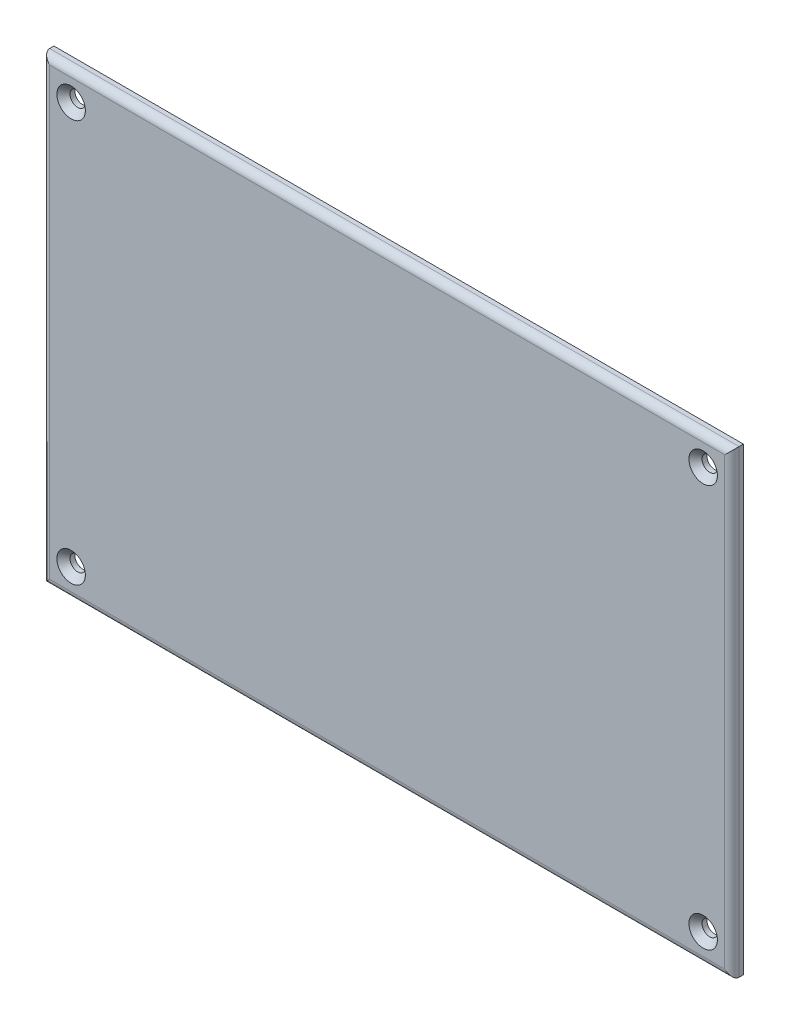
ISO-10303-21;
HEADER;
FILE_DESCRIPTION(('STEP AP214'),'2;1');
FILE_NAME('part.step','',(''),(''),'','','');
FILE_SCHEMA(('AUTOMOTIVE_DESIGN { 1 0 10303 214 1 1 1 1 }'));
ENDSEC;
DATA;
#1=APPLICATION_CONTEXT('core data for automotive mechanical design processes');
#2=APPLICATION_PROTOCOL_DEFINITION('international standard','automotive_design',2000,#1);
#3=PRODUCT_CONTEXT('',#1,'mechanical');
#4=PRODUCT('Part','Part','',(#3));
#5=PRODUCT_RELATED_PRODUCT_CATEGORY('part','',(#4));
#6=PRODUCT_DEFINITION_FORMATION('','',#4);
#7=PRODUCT_DEFINITION_CONTEXT('part definition',#1,'design');
#8=PRODUCT_DEFINITION('design','',#6,#7);
#9=PRODUCT_DEFINITION_SHAPE('','',#8);
#10=(LENGTH_UNIT() NAMED_UNIT(*) SI_UNIT(.MILLI.,.METRE.));
#11=(NAMED_UNIT(*) PLANE_ANGLE_UNIT() SI_UNIT($,.RADIAN.));
#12=(NAMED_UNIT(*) SI_UNIT($,.STERADIAN.) SOLID_ANGLE_UNIT());
#13=UNCERTAINTY_MEASURE_WITH_UNIT(LENGTH_MEASURE(1.E-05),#10,'distance_accuracy_value','');
#14=(GEOMETRIC_REPRESENTATION_CONTEXT(3) GLOBAL_UNCERTAINTY_ASSIGNED_CONTEXT((#13)) GLOBAL_UNIT_ASSIGNED_CONTEXT((#10,
#11,#12)) REPRESENTATION_CONTEXT('',''));
#15=CARTESIAN_POINT('',(0.,0.,0.));
#16=DIRECTION('',(0.,0.,1.));
#17=DIRECTION('',(1.,0.,0.));
#18=AXIS2_PLACEMENT_3D('',#15,#16,#17);
#19=CARTESIAN_POINT('',(0.,0.,2.54));
#20=DIRECTION('',(1.,0.,0.));
#21=DIRECTION('',(0.,0.,-1.));
#22=AXIS2_PLACEMENT_3D('',#19,#20,#21);
#23=PLANE('',#22);
#24=DIRECTION('',(0.,0.,-1.));
#25=VECTOR('',#24,1.);
#26=CARTESIAN_POINT('',(0.,0.,2.54));
#27=LINE('',#26,#25);
#28=CARTESIAN_POINT('',(0.,0.,0.9525));
#29=VERTEX_POINT('',#28);
#30=CARTESIAN_POINT('',(0.,0.,0.));
#31=VERTEX_POINT('',#30);
#32=EDGE_CURVE('E91',#29,#31,#27,.T.);
#33=ORIENTED_EDGE('',*,*,#32,.F.);
#34=DIRECTION('',(0.,-1.,0.));
#35=VECTOR('',#34,1.);
#36=CARTESIAN_POINT('',(0.,0.,0.9525));
#37=LINE('',#36,#35);
#38=CARTESIAN_POINT('',(0.,101.6,0.9525));
#39=VERTEX_POINT('',#38);
#40=EDGE_CURVE('E11',#29,#39,#37,.F.);
#41=ORIENTED_EDGE('',*,*,#40,.T.);
#42=DIRECTION('',(0.,0.,-1.));
#43=VECTOR('',#42,1.);
#44=CARTESIAN_POINT('',(0.,101.6,2.54));
#45=LINE('',#44,#43);
#46=CARTESIAN_POINT('',(0.,101.6,0.));
#47=VERTEX_POINT('',#46);
#48=EDGE_CURVE('E113',#39,#47,#45,.T.);
#49=ORIENTED_EDGE('',*,*,#48,.T.);
#50=DIRECTION('',(0.,-1.,0.));
#51=VECTOR('',#50,1.);
#52=CARTESIAN_POINT('',(0.,0.,0.));
#53=LINE('',#52,#51);
#54=EDGE_CURVE('E107',#47,#31,#53,.T.);
#55=ORIENTED_EDGE('',*,*,#54,.T.);
#56=EDGE_LOOP('',(#33,#41,#49,#55));
#57=FACE_BOUND('',#56,.T.);
#58=ADVANCED_FACE('F38',(#57),#23,.F.);
#59=CARTESIAN_POINT('',(0.,0.,2.54));
#60=DIRECTION('',(0.,1.,0.));
#61=DIRECTION('',(0.,0.,1.));
#62=AXIS2_PLACEMENT_3D('',#59,#60,#61);
#63=PLANE('',#62);
#64=DIRECTION('',(0.,0.,-1.));
#65=VECTOR('',#64,1.);
#66=CARTESIAN_POINT('',(152.4,0.,2.54));
#67=LINE('',#66,#65);
#68=CARTESIAN_POINT('',(152.4,0.,0.9525));
#69=VERTEX_POINT('',#68);
#70=CARTESIAN_POINT('',(152.4,0.,0.));
#71=VERTEX_POINT('',#70);
#72=EDGE_CURVE('E101',#69,#71,#67,.T.);
#73=ORIENTED_EDGE('',*,*,#72,.F.);
#74=DIRECTION('',(1.,0.,0.));
#75=VECTOR('',#74,1.);
#76=CARTESIAN_POINT('',(0.,0.,0.9525));
#77=LINE('',#76,#75);
#78=EDGE_CURVE('E48',#69,#29,#77,.F.);
#79=ORIENTED_EDGE('',*,*,#78,.T.);
#80=ORIENTED_EDGE('',*,*,#32,.T.);
#81=DIRECTION('',(1.,0.,0.));
#82=VECTOR('',#81,1.);
#83=CARTESIAN_POINT('',(0.,0.,0.));
#84=LINE('',#83,#82);
#85=EDGE_CURVE('E94',#31,#71,#84,.T.);
#86=ORIENTED_EDGE('',*,*,#85,.T.);
#87=EDGE_LOOP('',(#73,#79,#80,#86));
#88=FACE_BOUND('',#87,.T.);
#89=ADVANCED_FACE('F93',(#88),#63,.F.);
#90=CARTESIAN_POINT('',(152.4,0.,2.54));
#91=DIRECTION('',(-1.,0.,0.));
#92=DIRECTION('',(0.,0.,1.));
#93=AXIS2_PLACEMENT_3D('',#90,#91,#92);
#94=PLANE('',#93);
#95=DIRECTION('',(0.,0.,-1.));
#96=VECTOR('',#95,1.);
#97=CARTESIAN_POINT('',(152.4,101.6,2.54));
#98=LINE('',#97,#96);
#99=CARTESIAN_POINT('',(152.4,101.6,0.9525));
#100=VERTEX_POINT('',#99);
#101=CARTESIAN_POINT('',(152.4,101.6,0.));
#102=VERTEX_POINT('',#101);
#103=EDGE_CURVE('E133',#100,#102,#98,.T.);
#104=ORIENTED_EDGE('',*,*,#103,.F.);
#105=DIRECTION('',(0.,1.,0.));
#106=VECTOR('',#105,1.);
#107=CARTESIAN_POINT('',(152.4,0.,0.9525));
#108=LINE('',#107,#106);
#109=EDGE_CURVE('E63',#100,#69,#108,.F.);
#110=ORIENTED_EDGE('',*,*,#109,.T.);
#111=ORIENTED_EDGE('',*,*,#72,.T.);
#112=DIRECTION('',(0.,1.,0.));
#113=VECTOR('',#112,1.);
#114=CARTESIAN_POINT('',(152.4,0.,0.));
#115=LINE('',#114,#113);
#116=EDGE_CURVE('E109',#71,#102,#115,.T.);
#117=ORIENTED_EDGE('',*,*,#116,.T.);
#118=EDGE_LOOP('',(#104,#110,#111,#117));
#119=FACE_BOUND('',#118,.T.);
#120=ADVANCED_FACE('F228',(#119),#94,.F.);
#121=CARTESIAN_POINT('',(0.,101.6,2.54));
#122=DIRECTION('',(0.,-1.,0.));
#123=DIRECTION('',(0.,0.,-1.));
#124=AXIS2_PLACEMENT_3D('',#121,#122,#123);
#125=PLANE('',#124);
#126=ORIENTED_EDGE('',*,*,#48,.F.);
#127=DIRECTION('',(-1.,0.,0.));
#128=VECTOR('',#127,1.);
#129=CARTESIAN_POINT('',(0.,101.6,0.9525));
#130=LINE('',#129,#128);
#131=EDGE_CURVE('E150',#39,#100,#130,.F.);
#132=ORIENTED_EDGE('',*,*,#131,.T.);
#133=ORIENTED_EDGE('',*,*,#103,.T.);
#134=DIRECTION('',(-1.,0.,0.));
#135=VECTOR('',#134,1.);
#136=CARTESIAN_POINT('',(0.,101.6,0.));
#137=LINE('',#136,#135);
#138=EDGE_CURVE('E128',#102,#47,#137,.T.);
#139=ORIENTED_EDGE('',*,*,#138,.T.);
#140=EDGE_LOOP('',(#126,#132,#133,#139));
#141=FACE_BOUND('',#140,.T.);
#142=ADVANCED_FACE('F254',(#141),#125,.F.);
#143=CARTESIAN_POINT('',(0.,0.,2.54));
#144=DIRECTION('',(0.,0.,-1.));
#145=DIRECTION('',(-1.,0.,0.));
#146=AXIS2_PLACEMENT_3D('',#143,#144,#145);
#147=PLANE('',#146);
#148=CARTESIAN_POINT('',(6.34999999999999,95.25,2.54));
#149=DIRECTION('',(0.,0.,1.));
#150=DIRECTION('',(1.,0.,0.));
#151=AXIS2_PLACEMENT_3D('',#148,#149,#150);
#152=CIRCLE('',#151,3.15);
#153=CARTESIAN_POINT('',(9.49999999999999,95.25,2.54));
#154=VERTEX_POINT('',#153);
#155=EDGE_CURVE('E384',#154,#154,#152,.T.);
#156=ORIENTED_EDGE('',*,*,#155,.F.);
#157=EDGE_LOOP('',(#156));
#158=FACE_BOUND('',#157,.T.);
#159=CARTESIAN_POINT('',(6.35,6.35,2.54));
#160=DIRECTION('',(0.,0.,1.));
#161=DIRECTION('',(1.,0.,0.));
#162=AXIS2_PLACEMENT_3D('',#159,#160,#161);
#163=CIRCLE('',#162,3.15);
#164=CARTESIAN_POINT('',(9.5,6.35,2.54));
#165=VERTEX_POINT('',#164);
#166=EDGE_CURVE('E188',#165,#165,#163,.T.);
#167=ORIENTED_EDGE('',*,*,#166,.F.);
#168=EDGE_LOOP('',(#167));
#169=FACE_BOUND('',#168,.T.);
#170=CARTESIAN_POINT('',(146.05,6.35,2.54));
#171=DIRECTION('',(0.,0.,1.));
#172=DIRECTION('',(1.,0.,0.));
#173=AXIS2_PLACEMENT_3D('',#170,#171,#172);
#174=CIRCLE('',#173,3.15000000000001);
#175=CARTESIAN_POINT('',(149.2,6.35,2.54));
#176=VERTEX_POINT('',#175);
#177=EDGE_CURVE('E179',#176,#176,#174,.T.);
#178=ORIENTED_EDGE('',*,*,#177,.F.);
#179=EDGE_LOOP('',(#178));
#180=FACE_BOUND('',#179,.T.);
#181=CARTESIAN_POINT('',(146.05,95.25,2.54));
#182=DIRECTION('',(0.,0.,1.));
#183=DIRECTION('',(1.,0.,0.));
#184=AXIS2_PLACEMENT_3D('',#181,#182,#183);
#185=CIRCLE('',#184,3.15000000000001);
#186=CARTESIAN_POINT('',(149.2,95.25,2.54));
#187=VERTEX_POINT('',#186);
#188=EDGE_CURVE('E174',#187,#187,#185,.T.);
#189=ORIENTED_EDGE('',*,*,#188,.F.);
#190=EDGE_LOOP('',(#189));
#191=FACE_BOUND('',#190,.T.);
#192=DIRECTION('',(0.,1.,0.));
#193=VECTOR('',#192,1.);
#194=CARTESIAN_POINT('',(150.8125,0.,2.54));
#195=LINE('',#194,#193);
#196=CARTESIAN_POINT('',(150.8125,1.5875,2.54));
#197=VERTEX_POINT('',#196);
#198=CARTESIAN_POINT('',(150.8125,100.0125,2.54));
#199=VERTEX_POINT('',#198);
#200=EDGE_CURVE('E143',#197,#199,#195,.T.);
#201=ORIENTED_EDGE('',*,*,#200,.T.);
#202=DIRECTION('',(-1.,0.,0.));
#203=VECTOR('',#202,1.);
#204=CARTESIAN_POINT('',(0.,100.0125,2.54));
#205=LINE('',#204,#203);
#206=CARTESIAN_POINT('',(1.5875,100.0125,2.54));
#207=VERTEX_POINT('',#206);
#208=EDGE_CURVE('E146',#199,#207,#205,.T.);
#209=ORIENTED_EDGE('',*,*,#208,.T.);
#210=DIRECTION('',(0.,-1.,0.));
#211=VECTOR('',#210,1.);
#212=CARTESIAN_POINT('',(1.5875,0.,2.54));
#213=LINE('',#212,#211);
#214=CARTESIAN_POINT('',(1.5875,1.5875,2.54));
#215=VERTEX_POINT('',#214);
#216=EDGE_CURVE('E100',#207,#215,#213,.T.);
#217=ORIENTED_EDGE('',*,*,#216,.T.);
#218=DIRECTION('',(1.,0.,0.));
#219=VECTOR('',#218,1.);
#220=CARTESIAN_POINT('',(0.,1.5875,2.54));
#221=LINE('',#220,#219);
#222=EDGE_CURVE('E140',#215,#197,#221,.T.);
#223=ORIENTED_EDGE('',*,*,#222,.T.);
#224=EDGE_LOOP('',(#201,#209,#217,#223));
#225=FACE_BOUND('',#224,.T.);
#226=ADVANCED_FACE('F257',(#158,#169,#180,#191,#225),#147,.F.);
#227=CARTESIAN_POINT('',(0.,0.,0.));
#228=DIRECTION('',(0.,0.,-1.));
#229=DIRECTION('',(-1.,0.,0.));
#230=AXIS2_PLACEMENT_3D('',#227,#228,#229);
#231=PLANE('',#230);
#232=CARTESIAN_POINT('',(6.34999999999999,95.25,0.));
#233=DIRECTION('',(0.,0.,-1.));
#234=DIRECTION('',(-1.,0.,0.));
#235=AXIS2_PLACEMENT_3D('',#232,#233,#234);
#236=CIRCLE('',#235,1.69999999999999);
#237=CARTESIAN_POINT('',(4.64999999999999,95.25,0.));
#238=VERTEX_POINT('',#237);
#239=EDGE_CURVE('E42',#238,#238,#236,.T.);
#240=ORIENTED_EDGE('',*,*,#239,.F.);
#241=EDGE_LOOP('',(#240));
#242=FACE_BOUND('',#241,.T.);
#243=CARTESIAN_POINT('',(6.35,6.35,0.));
#244=DIRECTION('',(0.,0.,-1.));
#245=DIRECTION('',(-1.,0.,0.));
#246=AXIS2_PLACEMENT_3D('',#243,#244,#245);
#247=CIRCLE('',#246,1.69999999999999);
#248=CARTESIAN_POINT('',(4.65000000000001,6.35,0.));
#249=VERTEX_POINT('',#248);
#250=EDGE_CURVE('E176',#249,#249,#247,.T.);
#251=ORIENTED_EDGE('',*,*,#250,.F.);
#252=EDGE_LOOP('',(#251));
#253=FACE_BOUND('',#252,.T.);
#254=CARTESIAN_POINT('',(146.05,6.35,0.));
#255=DIRECTION('',(0.,0.,-1.));
#256=DIRECTION('',(-1.,0.,0.));
#257=AXIS2_PLACEMENT_3D('',#254,#255,#256);
#258=CIRCLE('',#257,1.69999999999999);
#259=CARTESIAN_POINT('',(144.35,6.35,0.));
#260=VERTEX_POINT('',#259);
#261=EDGE_CURVE('E171',#260,#260,#258,.T.);
#262=ORIENTED_EDGE('',*,*,#261,.F.);
#263=EDGE_LOOP('',(#262));
#264=FACE_BOUND('',#263,.T.);
#265=CARTESIAN_POINT('',(146.05,95.25,0.));
#266=DIRECTION('',(0.,0.,-1.));
#267=DIRECTION('',(-1.,0.,0.));
#268=AXIS2_PLACEMENT_3D('',#265,#266,#267);
#269=CIRCLE('',#268,1.69999999999999);
#270=CARTESIAN_POINT('',(144.35,95.25,0.));
#271=VERTEX_POINT('',#270);
#272=EDGE_CURVE('E162',#271,#271,#269,.T.);
#273=ORIENTED_EDGE('',*,*,#272,.F.);
#274=EDGE_LOOP('',(#273));
#275=FACE_BOUND('',#274,.T.);
#276=ORIENTED_EDGE('',*,*,#54,.F.);
#277=ORIENTED_EDGE('',*,*,#138,.F.);
#278=ORIENTED_EDGE('',*,*,#116,.F.);
#279=ORIENTED_EDGE('',*,*,#85,.F.);
#280=EDGE_LOOP('',(#276,#277,#278,#279));
#281=FACE_BOUND('',#280,.T.);
#282=ADVANCED_FACE('F105',(#242,#253,#264,#275,#281),#231,.T.);
#283=CARTESIAN_POINT('',(0.,1.5875,0.9525));
#284=DIRECTION('',(1.,0.,0.));
#285=DIRECTION('',(0.,0.,-1.));
#286=AXIS2_PLACEMENT_3D('',#283,#284,#285);
#287=CYLINDRICAL_SURFACE('',#286,1.5875);
#288=CARTESIAN_POINT('',(1.5875,1.5875,0.9525));
#289=DIRECTION('',(0.707106781186547,-0.707106781186547,0.));
#290=DIRECTION('',(-0.707106781186547,-0.707106781186547,0.));
#291=AXIS2_PLACEMENT_3D('',#288,#289,#290);
#292=ELLIPSE('',#291,2.24506403026729,1.5875);
#293=EDGE_CURVE('E120',#29,#215,#292,.F.);
#294=ORIENTED_EDGE('',*,*,#293,.F.);
#295=ORIENTED_EDGE('',*,*,#78,.F.);
#296=CARTESIAN_POINT('',(150.8125,1.5875,0.9525));
#297=DIRECTION('',(0.707106781186547,0.707106781186547,0.));
#298=DIRECTION('',(0.707106781186547,-0.707106781186547,0.));
#299=AXIS2_PLACEMENT_3D('',#296,#297,#298);
#300=ELLIPSE('',#299,2.24506403026729,1.5875);
#301=EDGE_CURVE('E116',#197,#69,#300,.T.);
#302=ORIENTED_EDGE('',*,*,#301,.F.);
#303=ORIENTED_EDGE('',*,*,#222,.F.);
#304=EDGE_LOOP('',(#294,#295,#302,#303));
#305=FACE_BOUND('',#304,.T.);
#306=ADVANCED_FACE('F40',(#305),#287,.T.);
#307=CARTESIAN_POINT('',(150.8125,0.,0.9525));
#308=DIRECTION('',(0.,1.,0.));
#309=DIRECTION('',(0.,0.,1.));
#310=AXIS2_PLACEMENT_3D('',#307,#308,#309);
#311=CYLINDRICAL_SURFACE('',#310,1.5875);
#312=ORIENTED_EDGE('',*,*,#301,.T.);
#313=ORIENTED_EDGE('',*,*,#109,.F.);
#314=CARTESIAN_POINT('',(150.8125,100.0125,0.9525));
#315=DIRECTION('',(-0.707106781186547,0.707106781186547,0.));
#316=DIRECTION('',(0.707106781186547,0.707106781186547,0.));
#317=AXIS2_PLACEMENT_3D('',#314,#315,#316);
#318=ELLIPSE('',#317,2.24506403026729,1.5875);
#319=EDGE_CURVE('E161',#199,#100,#318,.T.);
#320=ORIENTED_EDGE('',*,*,#319,.F.);
#321=ORIENTED_EDGE('',*,*,#200,.F.);
#322=EDGE_LOOP('',(#312,#313,#320,#321));
#323=FACE_BOUND('',#322,.T.);
#324=ADVANCED_FACE('F237',(#323),#311,.T.);
#325=CARTESIAN_POINT('',(1.5875,0.,0.9525));
#326=DIRECTION('',(0.,-1.,0.));
#327=DIRECTION('',(0.,0.,-1.));
#328=AXIS2_PLACEMENT_3D('',#325,#326,#327);
#329=CYLINDRICAL_SURFACE('',#328,1.5875);
#330=ORIENTED_EDGE('',*,*,#293,.T.);
#331=ORIENTED_EDGE('',*,*,#216,.F.);
#332=CARTESIAN_POINT('',(1.5875,100.0125,0.9525));
#333=DIRECTION('',(-0.707106781186547,-0.707106781186547,0.));
#334=DIRECTION('',(0.707106781186547,-0.707106781186547,0.));
#335=AXIS2_PLACEMENT_3D('',#332,#333,#334);
#336=ELLIPSE('',#335,2.24506403026729,1.5875);
#337=EDGE_CURVE('E158',#39,#207,#336,.F.);
#338=ORIENTED_EDGE('',*,*,#337,.F.);
#339=ORIENTED_EDGE('',*,*,#40,.F.);
#340=EDGE_LOOP('',(#330,#331,#338,#339));
#341=FACE_BOUND('',#340,.T.);
#342=ADVANCED_FACE('F234',(#341),#329,.T.);
#343=CARTESIAN_POINT('',(0.,100.0125,0.9525));
#344=DIRECTION('',(-1.,0.,0.));
#345=DIRECTION('',(0.,0.,1.));
#346=AXIS2_PLACEMENT_3D('',#343,#344,#345);
#347=CYLINDRICAL_SURFACE('',#346,1.5875);
#348=ORIENTED_EDGE('',*,*,#319,.T.);
#349=ORIENTED_EDGE('',*,*,#131,.F.);
#350=ORIENTED_EDGE('',*,*,#337,.T.);
#351=ORIENTED_EDGE('',*,*,#208,.F.);
#352=EDGE_LOOP('',(#348,#349,#350,#351));
#353=FACE_BOUND('',#352,.T.);
#354=ADVANCED_FACE('F220',(#353),#347,.T.);
#355=CARTESIAN_POINT('',(146.05,95.25,2.54));
#356=DIRECTION('',(0.,0.,1.));
#357=DIRECTION('',(1.,0.,0.));
#358=AXIS2_PLACEMENT_3D('',#355,#356,#357);
#359=CYLINDRICAL_SURFACE('',#358,1.69999999999999);
#360=ORIENTED_EDGE('',*,*,#272,.T.);
#361=EDGE_LOOP('',(#360));
#362=FACE_BOUND('',#361,.T.);
#363=CARTESIAN_POINT('',(146.05,95.25,1.09));
#364=DIRECTION('',(0.,0.,1.));
#365=DIRECTION('',(1.,0.,0.));
#366=AXIS2_PLACEMENT_3D('',#363,#364,#365);
#367=CIRCLE('',#366,1.70000000000001);
#368=CARTESIAN_POINT('',(147.75,95.25,1.09));
#369=VERTEX_POINT('',#368);
#370=EDGE_CURVE('E123',#369,#369,#367,.T.);
#371=ORIENTED_EDGE('',*,*,#370,.T.);
#372=EDGE_LOOP('',(#371));
#373=FACE_BOUND('',#372,.T.);
#374=ADVANCED_FACE('F207',(#362,#373),#359,.F.);
#375=CARTESIAN_POINT('',(146.05,95.25,2.54));
#376=DIRECTION('',(0.,0.,1.));
#377=DIRECTION('',(1.,0.,0.));
#378=AXIS2_PLACEMENT_3D('',#375,#376,#377);
#379=CONICAL_SURFACE('',#378,3.15000000000001,0.78539816339745);
#380=ORIENTED_EDGE('',*,*,#370,.F.);
#381=EDGE_LOOP('',(#380));
#382=FACE_BOUND('',#381,.T.);
#383=ORIENTED_EDGE('',*,*,#188,.T.);
#384=EDGE_LOOP('',(#383));
#385=FACE_BOUND('',#384,.T.);
#386=ADVANCED_FACE('F209',(#382,#385),#379,.F.);
#387=CARTESIAN_POINT('',(146.05,6.35,2.54));
#388=DIRECTION('',(0.,0.,1.));
#389=DIRECTION('',(1.,0.,0.));
#390=AXIS2_PLACEMENT_3D('',#387,#388,#389);
#391=CYLINDRICAL_SURFACE('',#390,1.69999999999999);
#392=ORIENTED_EDGE('',*,*,#261,.T.);
#393=EDGE_LOOP('',(#392));
#394=FACE_BOUND('',#393,.T.);
#395=CARTESIAN_POINT('',(146.05,6.35,1.09));
#396=DIRECTION('',(0.,0.,1.));
#397=DIRECTION('',(1.,0.,0.));
#398=AXIS2_PLACEMENT_3D('',#395,#396,#397);
#399=CIRCLE('',#398,1.70000000000001);
#400=CARTESIAN_POINT('',(147.75,6.35,1.09));
#401=VERTEX_POINT('',#400);
#402=EDGE_CURVE('E175',#401,#401,#399,.T.);
#403=ORIENTED_EDGE('',*,*,#402,.T.);
#404=EDGE_LOOP('',(#403));
#405=FACE_BOUND('',#404,.T.);
#406=ADVANCED_FACE('F211',(#394,#405),#391,.F.);
#407=CARTESIAN_POINT('',(146.05,6.35,2.54));
#408=DIRECTION('',(0.,0.,1.));
#409=DIRECTION('',(1.,0.,0.));
#410=AXIS2_PLACEMENT_3D('',#407,#408,#409);
#411=CONICAL_SURFACE('',#410,3.15000000000001,0.78539816339745);
#412=ORIENTED_EDGE('',*,*,#402,.F.);
#413=EDGE_LOOP('',(#412));
#414=FACE_BOUND('',#413,.T.);
#415=ORIENTED_EDGE('',*,*,#177,.T.);
#416=EDGE_LOOP('',(#415));
#417=FACE_BOUND('',#416,.T.);
#418=ADVANCED_FACE('F217',(#414,#417),#411,.F.);
#419=CARTESIAN_POINT('',(6.35,6.35,2.54));
#420=DIRECTION('',(0.,0.,1.));
#421=DIRECTION('',(1.,0.,0.));
#422=AXIS2_PLACEMENT_3D('',#419,#420,#421);
#423=CYLINDRICAL_SURFACE('',#422,1.69999999999999);
#424=ORIENTED_EDGE('',*,*,#250,.T.);
#425=EDGE_LOOP('',(#424));
#426=FACE_BOUND('',#425,.T.);
#427=CARTESIAN_POINT('',(6.35,6.35,1.09));
#428=DIRECTION('',(0.,0.,1.));
#429=DIRECTION('',(1.,0.,0.));
#430=AXIS2_PLACEMENT_3D('',#427,#428,#429);
#431=CIRCLE('',#430,1.7);
#432=CARTESIAN_POINT('',(8.05,6.35,1.09));
#433=VERTEX_POINT('',#432);
#434=EDGE_CURVE('E180',#433,#433,#431,.T.);
#435=ORIENTED_EDGE('',*,*,#434,.T.);
#436=EDGE_LOOP('',(#435));
#437=FACE_BOUND('',#436,.T.);
#438=ADVANCED_FACE('F336',(#426,#437),#423,.F.);
#439=CARTESIAN_POINT('',(6.35,6.35,2.54));
#440=DIRECTION('',(0.,0.,1.));
#441=DIRECTION('',(1.,0.,0.));
#442=AXIS2_PLACEMENT_3D('',#439,#440,#441);
#443=CONICAL_SURFACE('',#442,3.15,0.785398163397449);
#444=ORIENTED_EDGE('',*,*,#434,.F.);
#445=EDGE_LOOP('',(#444));
#446=FACE_BOUND('',#445,.T.);
#447=ORIENTED_EDGE('',*,*,#166,.T.);
#448=EDGE_LOOP('',(#447));
#449=FACE_BOUND('',#448,.T.);
#450=ADVANCED_FACE('F346',(#446,#449),#443,.F.);
#451=CARTESIAN_POINT('',(6.34999999999999,95.25,2.54));
#452=DIRECTION('',(0.,0.,1.));
#453=DIRECTION('',(1.,0.,0.));
#454=AXIS2_PLACEMENT_3D('',#451,#452,#453);
#455=CYLINDRICAL_SURFACE('',#454,1.69999999999999);
#456=ORIENTED_EDGE('',*,*,#239,.T.);
#457=EDGE_LOOP('',(#456));
#458=FACE_BOUND('',#457,.T.);
#459=CARTESIAN_POINT('',(6.34999999999999,95.25,1.09));
#460=DIRECTION('',(0.,0.,1.));
#461=DIRECTION('',(1.,0.,0.));
#462=AXIS2_PLACEMENT_3D('',#459,#460,#461);
#463=CIRCLE('',#462,1.7);
#464=CARTESIAN_POINT('',(8.04999999999999,95.25,1.09));
#465=VERTEX_POINT('',#464);
#466=EDGE_CURVE('E382',#465,#465,#463,.T.);
#467=ORIENTED_EDGE('',*,*,#466,.T.);
#468=EDGE_LOOP('',(#467));
#469=FACE_BOUND('',#468,.T.);
#470=ADVANCED_FACE('F355',(#458,#469),#455,.F.);
#471=CARTESIAN_POINT('',(6.34999999999999,95.25,2.54));
#472=DIRECTION('',(0.,0.,1.));
#473=DIRECTION('',(1.,0.,0.));
#474=AXIS2_PLACEMENT_3D('',#471,#472,#473);
#475=CONICAL_SURFACE('',#474,3.15,0.785398163397449);
#476=ORIENTED_EDGE('',*,*,#466,.F.);
#477=EDGE_LOOP('',(#476));
#478=FACE_BOUND('',#477,.T.);
#479=ORIENTED_EDGE('',*,*,#155,.T.);
#480=EDGE_LOOP('',(#479));
#481=FACE_BOUND('',#480,.T.);
#482=ADVANCED_FACE('F365',(#478,#481),#475,.F.);
#483=CLOSED_SHELL('',(#58,#89,#120,#142,#226,#282,#306,#324,#342,#354,#374,#386,#406,#418,#438,
#450,#470,#482));
#484=MANIFOLD_SOLID_BREP('B2',#483);
#485=ADVANCED_BREP_SHAPE_REPRESENTATION('',(#18,#484),#14);
#486=SHAPE_DEFINITION_REPRESENTATION(#9,#485);
ENDSEC;
END-ISO-10303-21;
